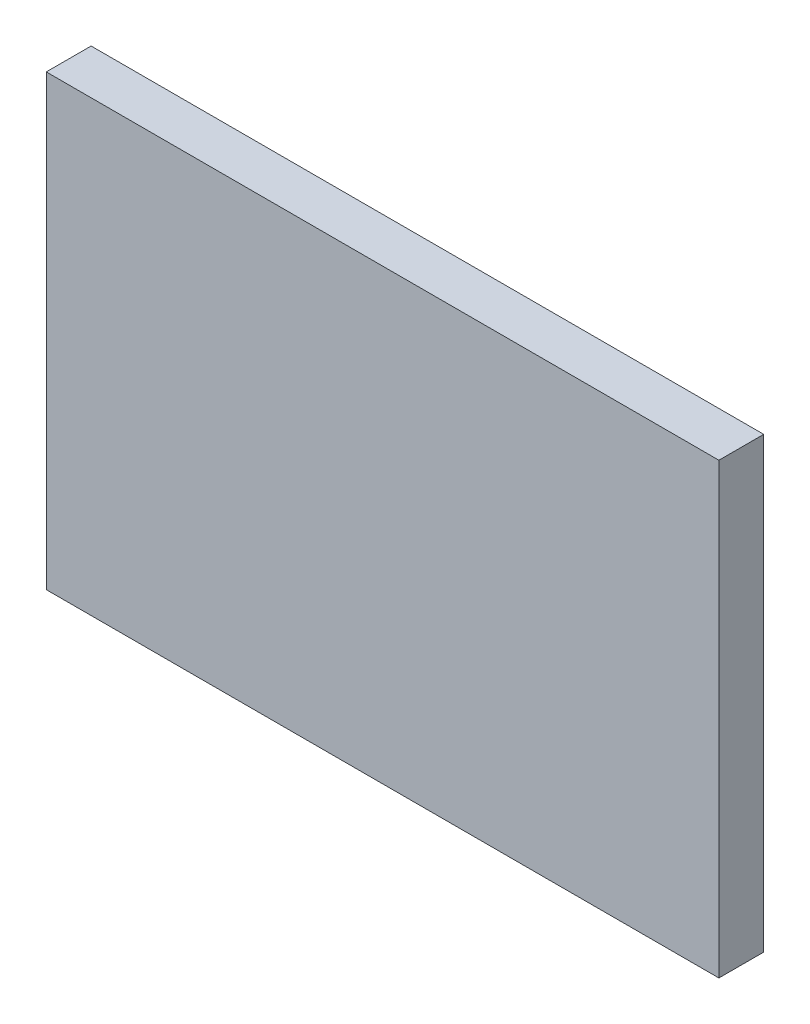
ISO-10303-21;
HEADER;
FILE_DESCRIPTION(('STEP AP214'),'2;1');
FILE_NAME('part.step','',(''),(''),'','','');
FILE_SCHEMA(('AUTOMOTIVE_DESIGN { 1 0 10303 214 1 1 1 1 }'));
ENDSEC;
DATA;
#1=APPLICATION_CONTEXT('core data for automotive mechanical design processes');
#2=APPLICATION_PROTOCOL_DEFINITION('international standard','automotive_design',2000,#1);
#3=PRODUCT_CONTEXT('',#1,'mechanical');
#4=PRODUCT('Part','Part','',(#3));
#5=PRODUCT_RELATED_PRODUCT_CATEGORY('part','',(#4));
#6=PRODUCT_DEFINITION_FORMATION('','',#4);
#7=PRODUCT_DEFINITION_CONTEXT('part definition',#1,'design');
#8=PRODUCT_DEFINITION('design','',#6,#7);
#9=PRODUCT_DEFINITION_SHAPE('','',#8);
#10=(LENGTH_UNIT() NAMED_UNIT(*) SI_UNIT(.MILLI.,.METRE.));
#11=(NAMED_UNIT(*) PLANE_ANGLE_UNIT() SI_UNIT($,.RADIAN.));
#12=(NAMED_UNIT(*) SI_UNIT($,.STERADIAN.) SOLID_ANGLE_UNIT());
#13=UNCERTAINTY_MEASURE_WITH_UNIT(LENGTH_MEASURE(1.E-05),#10,'distance_accuracy_value','');
#14=(GEOMETRIC_REPRESENTATION_CONTEXT(3) GLOBAL_UNCERTAINTY_ASSIGNED_CONTEXT((#13)) GLOBAL_UNIT_ASSIGNED_CONTEXT((#10,
#11,#12)) REPRESENTATION_CONTEXT('',''));
#15=CARTESIAN_POINT('',(0.,0.,0.));
#16=DIRECTION('',(0.,0.,1.));
#17=DIRECTION('',(1.,0.,0.));
#18=AXIS2_PLACEMENT_3D('',#15,#16,#17);
#19=CARTESIAN_POINT('',(-45.,-30.,6.));
#20=DIRECTION('',(1.,0.,0.));
#21=DIRECTION('',(0.,0.,-1.));
#22=AXIS2_PLACEMENT_3D('',#19,#20,#21);
#23=PLANE('',#22);
#24=DIRECTION('',(0.,-1.,0.));
#25=VECTOR('',#24,1.);
#26=CARTESIAN_POINT('',(-45.,-30.,0.));
#27=LINE('',#26,#25);
#28=CARTESIAN_POINT('',(-45.,30.,0.));
#29=VERTEX_POINT('',#28);
#30=CARTESIAN_POINT('',(-45.,-30.,0.));
#31=VERTEX_POINT('',#30);
#32=EDGE_CURVE('E102',#29,#31,#27,.T.);
#33=ORIENTED_EDGE('',*,*,#32,.T.);
#34=DIRECTION('',(0.,0.,-1.));
#35=VECTOR('',#34,1.);
#36=CARTESIAN_POINT('',(-45.,-30.,6.));
#37=LINE('',#36,#35);
#38=CARTESIAN_POINT('',(-45.,-30.,6.));
#39=VERTEX_POINT('',#38);
#40=EDGE_CURVE('E11',#39,#31,#37,.T.);
#41=ORIENTED_EDGE('',*,*,#40,.F.);
#42=DIRECTION('',(0.,-1.,0.));
#43=VECTOR('',#42,1.);
#44=CARTESIAN_POINT('',(-45.,-30.,6.));
#45=LINE('',#44,#43);
#46=CARTESIAN_POINT('',(-45.,30.,6.));
#47=VERTEX_POINT('',#46);
#48=EDGE_CURVE('E90',#47,#39,#45,.T.);
#49=ORIENTED_EDGE('',*,*,#48,.F.);
#50=DIRECTION('',(0.,0.,-1.));
#51=VECTOR('',#50,1.);
#52=CARTESIAN_POINT('',(-45.,30.,6.));
#53=LINE('',#52,#51);
#54=EDGE_CURVE('E98',#47,#29,#53,.T.);
#55=ORIENTED_EDGE('',*,*,#54,.T.);
#56=EDGE_LOOP('',(#33,#41,#49,#55));
#57=FACE_BOUND('',#56,.T.);
#58=ADVANCED_FACE('F39',(#57),#23,.F.);
#59=CARTESIAN_POINT('',(45.,-30.,6.));
#60=DIRECTION('',(0.,1.,0.));
#61=DIRECTION('',(-1.,0.,0.));
#62=AXIS2_PLACEMENT_3D('',#59,#60,#61);
#63=PLANE('',#62);
#64=DIRECTION('',(1.,0.,0.));
#65=VECTOR('',#64,1.);
#66=CARTESIAN_POINT('',(45.,-30.,0.));
#67=LINE('',#66,#65);
#68=CARTESIAN_POINT('',(45.,-30.,0.));
#69=VERTEX_POINT('',#68);
#70=EDGE_CURVE('E94',#31,#69,#67,.T.);
#71=ORIENTED_EDGE('',*,*,#70,.T.);
#72=DIRECTION('',(0.,0.,-1.));
#73=VECTOR('',#72,1.);
#74=CARTESIAN_POINT('',(45.,-30.,6.));
#75=LINE('',#74,#73);
#76=CARTESIAN_POINT('',(45.,-30.,6.));
#77=VERTEX_POINT('',#76);
#78=EDGE_CURVE('E47',#77,#69,#75,.T.);
#79=ORIENTED_EDGE('',*,*,#78,.F.);
#80=DIRECTION('',(1.,0.,0.));
#81=VECTOR('',#80,1.);
#82=CARTESIAN_POINT('',(45.,-30.,6.));
#83=LINE('',#82,#81);
#84=EDGE_CURVE('E85',#39,#77,#83,.T.);
#85=ORIENTED_EDGE('',*,*,#84,.F.);
#86=ORIENTED_EDGE('',*,*,#40,.T.);
#87=EDGE_LOOP('',(#71,#79,#85,#86));
#88=FACE_BOUND('',#87,.T.);
#89=ADVANCED_FACE('F93',(#88),#63,.F.);
#90=CARTESIAN_POINT('',(45.,-30.,6.));
#91=DIRECTION('',(-1.,0.,0.));
#92=DIRECTION('',(0.,0.,1.));
#93=AXIS2_PLACEMENT_3D('',#90,#91,#92);
#94=PLANE('',#93);
#95=DIRECTION('',(0.,1.,0.));
#96=VECTOR('',#95,1.);
#97=CARTESIAN_POINT('',(45.,-30.,0.));
#98=LINE('',#97,#96);
#99=CARTESIAN_POINT('',(45.,30.,0.));
#100=VERTEX_POINT('',#99);
#101=EDGE_CURVE('E72',#69,#100,#98,.T.);
#102=ORIENTED_EDGE('',*,*,#101,.T.);
#103=DIRECTION('',(0.,0.,-1.));
#104=VECTOR('',#103,1.);
#105=CARTESIAN_POINT('',(45.,30.,6.));
#106=LINE('',#105,#104);
#107=CARTESIAN_POINT('',(45.,30.,6.));
#108=VERTEX_POINT('',#107);
#109=EDGE_CURVE('E95',#108,#100,#106,.T.);
#110=ORIENTED_EDGE('',*,*,#109,.F.);
#111=DIRECTION('',(0.,1.,0.));
#112=VECTOR('',#111,1.);
#113=CARTESIAN_POINT('',(45.,-30.,6.));
#114=LINE('',#113,#112);
#115=EDGE_CURVE('E88',#77,#108,#114,.T.);
#116=ORIENTED_EDGE('',*,*,#115,.F.);
#117=ORIENTED_EDGE('',*,*,#78,.T.);
#118=EDGE_LOOP('',(#102,#110,#116,#117));
#119=FACE_BOUND('',#118,.T.);
#120=ADVANCED_FACE('F96',(#119),#94,.F.);
#121=CARTESIAN_POINT('',(45.,30.,6.));
#122=DIRECTION('',(0.,-1.,0.));
#123=DIRECTION('',(1.,0.,0.));
#124=AXIS2_PLACEMENT_3D('',#121,#122,#123);
#125=PLANE('',#124);
#126=DIRECTION('',(-1.,0.,0.));
#127=VECTOR('',#126,1.);
#128=CARTESIAN_POINT('',(45.,30.,0.));
#129=LINE('',#128,#127);
#130=EDGE_CURVE('E78',#100,#29,#129,.T.);
#131=ORIENTED_EDGE('',*,*,#130,.T.);
#132=ORIENTED_EDGE('',*,*,#54,.F.);
#133=DIRECTION('',(-1.,0.,0.));
#134=VECTOR('',#133,1.);
#135=CARTESIAN_POINT('',(45.,30.,6.));
#136=LINE('',#135,#134);
#137=EDGE_CURVE('E55',#108,#47,#136,.T.);
#138=ORIENTED_EDGE('',*,*,#137,.F.);
#139=ORIENTED_EDGE('',*,*,#109,.T.);
#140=EDGE_LOOP('',(#131,#132,#138,#139));
#141=FACE_BOUND('',#140,.T.);
#142=ADVANCED_FACE('F109',(#141),#125,.F.);
#143=CARTESIAN_POINT('',(0.,0.,6.));
#144=DIRECTION('',(0.,0.,1.));
#145=DIRECTION('',(1.,0.,0.));
#146=AXIS2_PLACEMENT_3D('',#143,#144,#145);
#147=PLANE('',#146);
#148=ORIENTED_EDGE('',*,*,#48,.T.);
#149=ORIENTED_EDGE('',*,*,#84,.T.);
#150=ORIENTED_EDGE('',*,*,#115,.T.);
#151=ORIENTED_EDGE('',*,*,#137,.T.);
#152=EDGE_LOOP('',(#148,#149,#150,#151));
#153=FACE_BOUND('',#152,.T.);
#154=ADVANCED_FACE('F86',(#153),#147,.T.);
#155=CARTESIAN_POINT('',(0.,0.,0.));
#156=DIRECTION('',(0.,0.,1.));
#157=DIRECTION('',(1.,0.,0.));
#158=AXIS2_PLACEMENT_3D('',#155,#156,#157);
#159=PLANE('',#158);
#160=ORIENTED_EDGE('',*,*,#32,.F.);
#161=ORIENTED_EDGE('',*,*,#130,.F.);
#162=ORIENTED_EDGE('',*,*,#101,.F.);
#163=ORIENTED_EDGE('',*,*,#70,.F.);
#164=EDGE_LOOP('',(#160,#161,#162,#163));
#165=FACE_BOUND('',#164,.T.);
#166=ADVANCED_FACE('F112',(#165),#159,.F.);
#167=CLOSED_SHELL('',(#58,#89,#120,#142,#154,#166));
#168=MANIFOLD_SOLID_BREP('B2',#167);
#169=ADVANCED_BREP_SHAPE_REPRESENTATION('',(#18,#168),#14);
#170=SHAPE_DEFINITION_REPRESENTATION(#9,#169);
ENDSEC;
END-ISO-10303-21;
